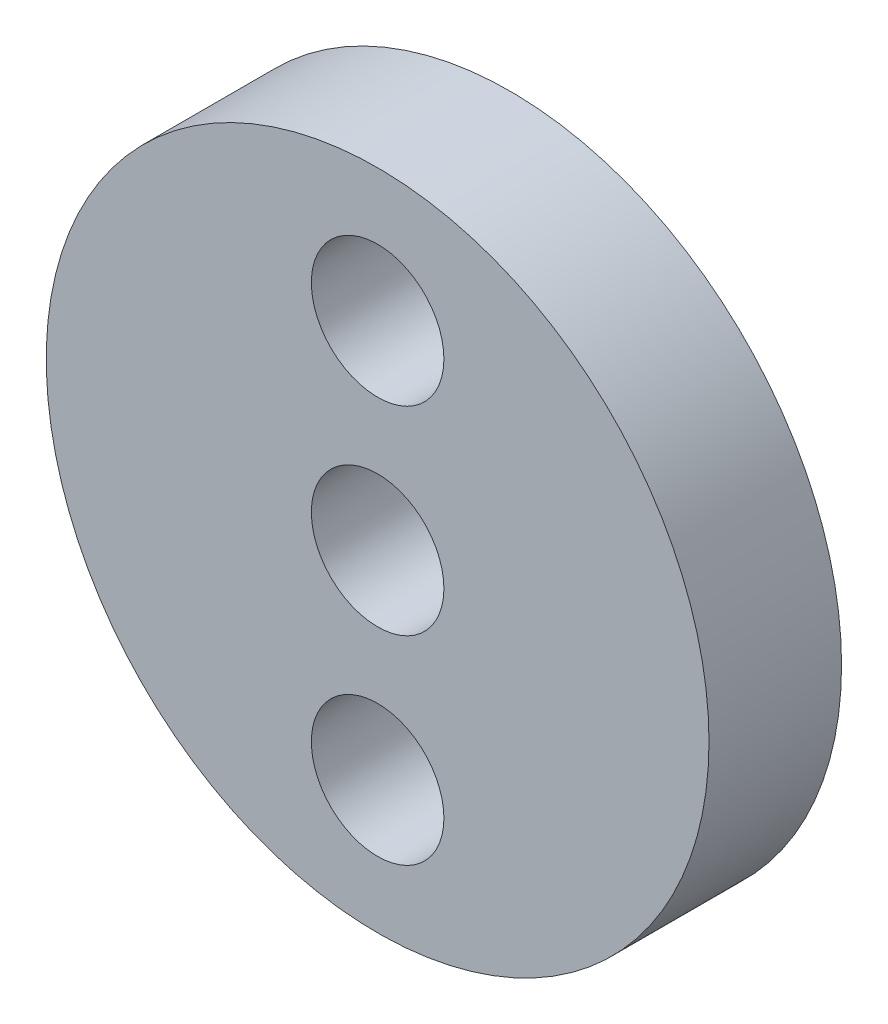
ISO-10303-21;
HEADER;
FILE_DESCRIPTION(('STEP AP214'),'2;1');
FILE_NAME('part.step','',(''),(''),'','','');
FILE_SCHEMA(('AUTOMOTIVE_DESIGN { 1 0 10303 214 1 1 1 1 }'));
ENDSEC;
DATA;
#1=APPLICATION_CONTEXT('core data for automotive mechanical design processes');
#2=APPLICATION_PROTOCOL_DEFINITION('international standard','automotive_design',2000,#1);
#3=PRODUCT_CONTEXT('',#1,'mechanical');
#4=PRODUCT('Part','Part','',(#3));
#5=PRODUCT_RELATED_PRODUCT_CATEGORY('part','',(#4));
#6=PRODUCT_DEFINITION_FORMATION('','',#4);
#7=PRODUCT_DEFINITION_CONTEXT('part definition',#1,'design');
#8=PRODUCT_DEFINITION('design','',#6,#7);
#9=PRODUCT_DEFINITION_SHAPE('','',#8);
#10=(LENGTH_UNIT() NAMED_UNIT(*) SI_UNIT(.MILLI.,.METRE.));
#11=(NAMED_UNIT(*) PLANE_ANGLE_UNIT() SI_UNIT($,.RADIAN.));
#12=(NAMED_UNIT(*) SI_UNIT($,.STERADIAN.) SOLID_ANGLE_UNIT());
#13=UNCERTAINTY_MEASURE_WITH_UNIT(LENGTH_MEASURE(1.E-05),#10,'distance_accuracy_value','');
#14=(GEOMETRIC_REPRESENTATION_CONTEXT(3) GLOBAL_UNCERTAINTY_ASSIGNED_CONTEXT((#13)) GLOBAL_UNIT_ASSIGNED_CONTEXT((#10,
#11,#12)) REPRESENTATION_CONTEXT('',''));
#15=CARTESIAN_POINT('',(0.,0.,0.));
#16=DIRECTION('',(0.,0.,1.));
#17=DIRECTION('',(1.,0.,0.));
#18=AXIS2_PLACEMENT_3D('',#15,#16,#17);
#19=CARTESIAN_POINT('',(0.,0.,6.));
#20=DIRECTION('',(0.,0.,1.));
#21=DIRECTION('',(1.,0.,0.));
#22=AXIS2_PLACEMENT_3D('',#19,#20,#21);
#23=PLANE('',#22);
#24=CARTESIAN_POINT('',(0.,9.,6.));
#25=DIRECTION('',(0.,0.,1.));
#26=DIRECTION('',(1.,0.,0.));
#27=AXIS2_PLACEMENT_3D('',#24,#25,#26);
#28=CIRCLE('',#27,3.);
#29=CARTESIAN_POINT('',(3.,9.,6.));
#30=VERTEX_POINT('',#29);
#31=EDGE_CURVE('E47',#30,#30,#28,.T.);
#32=ORIENTED_EDGE('',*,*,#31,.F.);
#33=EDGE_LOOP('',(#32));
#34=FACE_BOUND('',#33,.T.);
#35=CARTESIAN_POINT('',(0.,0.,6.));
#36=DIRECTION('',(0.,0.,1.));
#37=DIRECTION('',(1.,0.,0.));
#38=AXIS2_PLACEMENT_3D('',#35,#36,#37);
#39=CIRCLE('',#38,15.);
#40=CARTESIAN_POINT('',(15.,0.,6.));
#41=VERTEX_POINT('',#40);
#42=EDGE_CURVE('E10',#41,#41,#39,.T.);
#43=ORIENTED_EDGE('',*,*,#42,.T.);
#44=EDGE_LOOP('',(#43));
#45=FACE_BOUND('',#44,.T.);
#46=CARTESIAN_POINT('',(0.,0.,6.));
#47=DIRECTION('',(0.,0.,1.));
#48=DIRECTION('',(1.,0.,0.));
#49=AXIS2_PLACEMENT_3D('',#46,#47,#48);
#50=CIRCLE('',#49,3.);
#51=CARTESIAN_POINT('',(3.,0.,6.));
#52=VERTEX_POINT('',#51);
#53=EDGE_CURVE('E42',#52,#52,#50,.T.);
#54=ORIENTED_EDGE('',*,*,#53,.F.);
#55=EDGE_LOOP('',(#54));
#56=FACE_BOUND('',#55,.T.);
#57=CARTESIAN_POINT('',(0.,-9.,6.));
#58=DIRECTION('',(0.,0.,1.));
#59=DIRECTION('',(1.,0.,0.));
#60=AXIS2_PLACEMENT_3D('',#57,#58,#59);
#61=CIRCLE('',#60,3.);
#62=CARTESIAN_POINT('',(3.,-9.,6.));
#63=VERTEX_POINT('',#62);
#64=EDGE_CURVE('E53',#63,#63,#61,.T.);
#65=ORIENTED_EDGE('',*,*,#64,.F.);
#66=EDGE_LOOP('',(#65));
#67=FACE_BOUND('',#66,.T.);
#68=ADVANCED_FACE('F31',(#34,#45,#56,#67),#23,.T.);
#69=CARTESIAN_POINT('',(0.,0.,0.));
#70=DIRECTION('',(0.,0.,1.));
#71=DIRECTION('',(1.,0.,0.));
#72=AXIS2_PLACEMENT_3D('',#69,#70,#71);
#73=PLANE('',#72);
#74=CARTESIAN_POINT('',(0.,0.,0.));
#75=DIRECTION('',(0.,0.,1.));
#76=DIRECTION('',(1.,0.,0.));
#77=AXIS2_PLACEMENT_3D('',#74,#75,#76);
#78=CIRCLE('',#77,15.);
#79=CARTESIAN_POINT('',(15.,0.,0.));
#80=VERTEX_POINT('',#79);
#81=EDGE_CURVE('E35',#80,#80,#78,.T.);
#82=ORIENTED_EDGE('',*,*,#81,.F.);
#83=EDGE_LOOP('',(#82));
#84=FACE_BOUND('',#83,.T.);
#85=CARTESIAN_POINT('',(0.,0.,0.));
#86=DIRECTION('',(0.,0.,1.));
#87=DIRECTION('',(1.,0.,0.));
#88=AXIS2_PLACEMENT_3D('',#85,#86,#87);
#89=CIRCLE('',#88,3.);
#90=CARTESIAN_POINT('',(3.,0.,0.));
#91=VERTEX_POINT('',#90);
#92=EDGE_CURVE('E44',#91,#91,#89,.T.);
#93=ORIENTED_EDGE('',*,*,#92,.T.);
#94=EDGE_LOOP('',(#93));
#95=FACE_BOUND('',#94,.T.);
#96=CARTESIAN_POINT('',(0.,9.,0.));
#97=DIRECTION('',(0.,0.,1.));
#98=DIRECTION('',(1.,0.,0.));
#99=AXIS2_PLACEMENT_3D('',#96,#97,#98);
#100=CIRCLE('',#99,3.);
#101=CARTESIAN_POINT('',(3.,9.,0.));
#102=VERTEX_POINT('',#101);
#103=EDGE_CURVE('E50',#102,#102,#100,.T.);
#104=ORIENTED_EDGE('',*,*,#103,.T.);
#105=EDGE_LOOP('',(#104));
#106=FACE_BOUND('',#105,.T.);
#107=CARTESIAN_POINT('',(0.,-9.,0.));
#108=DIRECTION('',(0.,0.,1.));
#109=DIRECTION('',(1.,0.,0.));
#110=AXIS2_PLACEMENT_3D('',#107,#108,#109);
#111=CIRCLE('',#110,3.);
#112=CARTESIAN_POINT('',(3.,-9.,0.));
#113=VERTEX_POINT('',#112);
#114=EDGE_CURVE('E56',#113,#113,#111,.T.);
#115=ORIENTED_EDGE('',*,*,#114,.T.);
#116=EDGE_LOOP('',(#115));
#117=FACE_BOUND('',#116,.T.);
#118=ADVANCED_FACE('F66',(#84,#95,#106,#117),#73,.F.);
#119=CARTESIAN_POINT('',(0.,0.,6.));
#120=DIRECTION('',(0.,0.,-1.));
#121=DIRECTION('',(-1.,0.,0.));
#122=AXIS2_PLACEMENT_3D('',#119,#120,#121);
#123=CYLINDRICAL_SURFACE('',#122,15.);
#124=ORIENTED_EDGE('',*,*,#42,.F.);
#125=EDGE_LOOP('',(#124));
#126=FACE_BOUND('',#125,.T.);
#127=ORIENTED_EDGE('',*,*,#81,.T.);
#128=EDGE_LOOP('',(#127));
#129=FACE_BOUND('',#128,.T.);
#130=ADVANCED_FACE('F33',(#126,#129),#123,.T.);
#131=CARTESIAN_POINT('',(0.,0.,6.));
#132=DIRECTION('',(0.,0.,-1.));
#133=DIRECTION('',(-1.,0.,0.));
#134=AXIS2_PLACEMENT_3D('',#131,#132,#133);
#135=CYLINDRICAL_SURFACE('',#134,3.);
#136=ORIENTED_EDGE('',*,*,#53,.T.);
#137=EDGE_LOOP('',(#136));
#138=FACE_BOUND('',#137,.T.);
#139=ORIENTED_EDGE('',*,*,#92,.F.);
#140=EDGE_LOOP('',(#139));
#141=FACE_BOUND('',#140,.T.);
#142=ADVANCED_FACE('F75',(#138,#141),#135,.F.);
#143=CARTESIAN_POINT('',(0.,9.,6.));
#144=DIRECTION('',(0.,0.,-1.));
#145=DIRECTION('',(-1.,0.,0.));
#146=AXIS2_PLACEMENT_3D('',#143,#144,#145);
#147=CYLINDRICAL_SURFACE('',#146,3.);
#148=ORIENTED_EDGE('',*,*,#31,.T.);
#149=EDGE_LOOP('',(#148));
#150=FACE_BOUND('',#149,.T.);
#151=ORIENTED_EDGE('',*,*,#103,.F.);
#152=EDGE_LOOP('',(#151));
#153=FACE_BOUND('',#152,.T.);
#154=ADVANCED_FACE('F78',(#150,#153),#147,.F.);
#155=CARTESIAN_POINT('',(0.,-9.,6.));
#156=DIRECTION('',(0.,0.,-1.));
#157=DIRECTION('',(-1.,0.,0.));
#158=AXIS2_PLACEMENT_3D('',#155,#156,#157);
#159=CYLINDRICAL_SURFACE('',#158,3.);
#160=ORIENTED_EDGE('',*,*,#64,.T.);
#161=EDGE_LOOP('',(#160));
#162=FACE_BOUND('',#161,.T.);
#163=ORIENTED_EDGE('',*,*,#114,.F.);
#164=EDGE_LOOP('',(#163));
#165=FACE_BOUND('',#164,.T.);
#166=ADVANCED_FACE('F62',(#162,#165),#159,.F.);
#167=CLOSED_SHELL('',(#68,#118,#130,#142,#154,#166));
#168=MANIFOLD_SOLID_BREP('B2',#167);
#169=ADVANCED_BREP_SHAPE_REPRESENTATION('',(#18,#168),#14);
#170=SHAPE_DEFINITION_REPRESENTATION(#9,#169);
ENDSEC;
END-ISO-10303-21;
